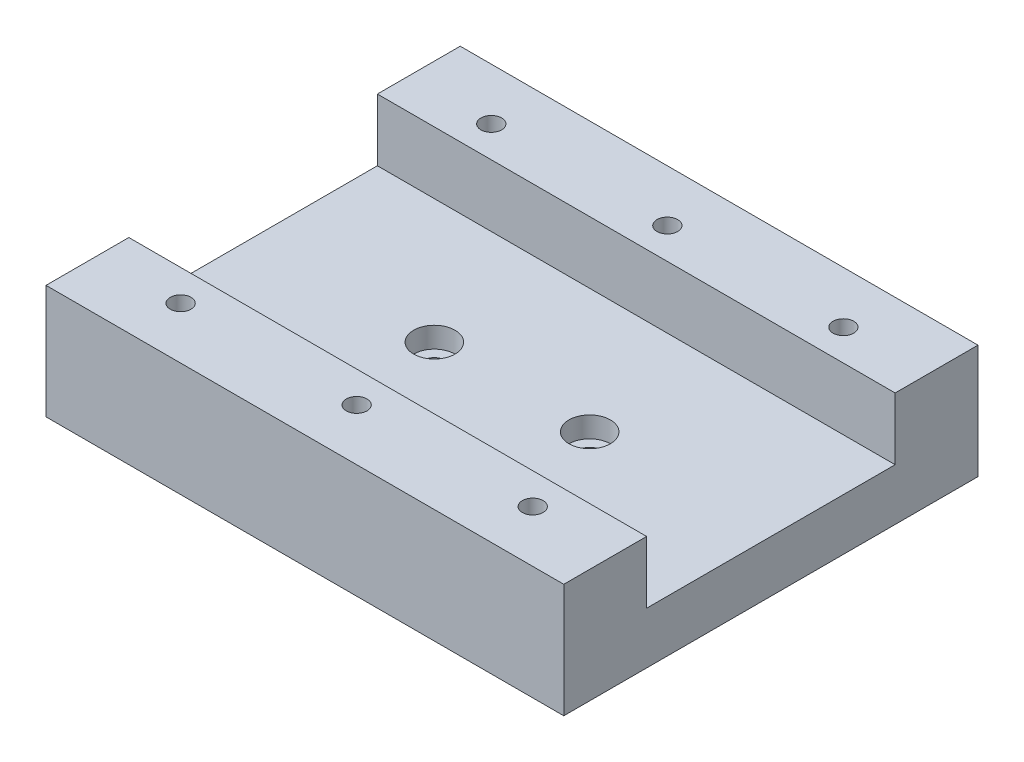
ISO-10303-21;
HEADER;
FILE_DESCRIPTION(('STEP AP214'),'2;1');
FILE_NAME('part.step','',(''),(''),'','','');
FILE_SCHEMA(('AUTOMOTIVE_DESIGN { 1 0 10303 214 1 1 1 1 }'));
ENDSEC;
DATA;
#1=APPLICATION_CONTEXT('core data for automotive mechanical design processes');
#2=APPLICATION_PROTOCOL_DEFINITION('international standard','automotive_design',2000,#1);
#3=PRODUCT_CONTEXT('',#1,'mechanical');
#4=PRODUCT('Part','Part','',(#3));
#5=PRODUCT_RELATED_PRODUCT_CATEGORY('part','',(#4));
#6=PRODUCT_DEFINITION_FORMATION('','',#4);
#7=PRODUCT_DEFINITION_CONTEXT('part definition',#1,'design');
#8=PRODUCT_DEFINITION('design','',#6,#7);
#9=PRODUCT_DEFINITION_SHAPE('','',#8);
#10=(LENGTH_UNIT() NAMED_UNIT(*) SI_UNIT(.MILLI.,.METRE.));
#11=(NAMED_UNIT(*) PLANE_ANGLE_UNIT() SI_UNIT($,.RADIAN.));
#12=(NAMED_UNIT(*) SI_UNIT($,.STERADIAN.) SOLID_ANGLE_UNIT());
#13=UNCERTAINTY_MEASURE_WITH_UNIT(LENGTH_MEASURE(1.E-05),#10,'distance_accuracy_value','');
#14=(GEOMETRIC_REPRESENTATION_CONTEXT(3) GLOBAL_UNCERTAINTY_ASSIGNED_CONTEXT((#13)) GLOBAL_UNIT_ASSIGNED_CONTEXT((#10,
#11,#12)) REPRESENTATION_CONTEXT('',''));
#15=CARTESIAN_POINT('',(0.,0.,0.));
#16=DIRECTION('',(0.,0.,1.));
#17=DIRECTION('',(1.,0.,0.));
#18=AXIS2_PLACEMENT_3D('',#15,#16,#17);
#19=CARTESIAN_POINT('',(0.,5.,0.));
#20=DIRECTION('',(0.,1.,0.));
#21=DIRECTION('',(0.,0.,1.));
#22=AXIS2_PLACEMENT_3D('',#19,#20,#21);
#23=PLANE('',#22);
#24=CARTESIAN_POINT('',(-7.5,5.,0.));
#25=DIRECTION('',(0.,1.,0.));
#26=DIRECTION('',(0.,0.,1.));
#27=AXIS2_PLACEMENT_3D('',#24,#25,#26);
#28=CIRCLE('',#27,2.);
#29=CARTESIAN_POINT('',(-7.5,5.,2.));
#30=VERTEX_POINT('',#29);
#31=EDGE_CURVE('E160',#30,#30,#28,.T.);
#32=ORIENTED_EDGE('',*,*,#31,.F.);
#33=EDGE_LOOP('',(#32));
#34=FACE_BOUND('',#33,.T.);
#35=CARTESIAN_POINT('',(7.5,5.,0.));
#36=DIRECTION('',(0.,1.,0.));
#37=DIRECTION('',(0.,0.,1.));
#38=AXIS2_PLACEMENT_3D('',#35,#36,#37);
#39=CIRCLE('',#38,2.);
#40=CARTESIAN_POINT('',(7.5,5.,2.));
#41=VERTEX_POINT('',#40);
#42=EDGE_CURVE('E165',#41,#41,#39,.T.);
#43=ORIENTED_EDGE('',*,*,#42,.F.);
#44=EDGE_LOOP('',(#43));
#45=FACE_BOUND('',#44,.T.);
#46=DIRECTION('',(0.,0.,1.));
#47=VECTOR('',#46,1.);
#48=CARTESIAN_POINT('',(-25.,5.,-20.));
#49=LINE('',#48,#47);
#50=CARTESIAN_POINT('',(-25.,5.,-12.));
#51=VERTEX_POINT('',#50);
#52=CARTESIAN_POINT('',(-25.,5.,12.));
#53=VERTEX_POINT('',#52);
#54=EDGE_CURVE('E125',#51,#53,#49,.T.);
#55=ORIENTED_EDGE('',*,*,#54,.T.);
#56=DIRECTION('',(-1.,0.,0.));
#57=VECTOR('',#56,1.);
#58=CARTESIAN_POINT('',(-25.,5.,12.));
#59=LINE('',#58,#57);
#60=CARTESIAN_POINT('',(25.,5.,12.));
#61=VERTEX_POINT('',#60);
#62=EDGE_CURVE('E114',#61,#53,#59,.T.);
#63=ORIENTED_EDGE('',*,*,#62,.F.);
#64=DIRECTION('',(0.,0.,-1.));
#65=VECTOR('',#64,1.);
#66=CARTESIAN_POINT('',(25.,5.,-20.));
#67=LINE('',#66,#65);
#68=CARTESIAN_POINT('',(25.,5.,-12.));
#69=VERTEX_POINT('',#68);
#70=EDGE_CURVE('E131',#61,#69,#67,.T.);
#71=ORIENTED_EDGE('',*,*,#70,.T.);
#72=DIRECTION('',(1.,0.,0.));
#73=VECTOR('',#72,1.);
#74=CARTESIAN_POINT('',(-25.,5.,-12.));
#75=LINE('',#74,#73);
#76=EDGE_CURVE('E72',#51,#69,#75,.T.);
#77=ORIENTED_EDGE('',*,*,#76,.F.);
#78=EDGE_LOOP('',(#55,#63,#71,#77));
#79=FACE_BOUND('',#78,.T.);
#80=ADVANCED_FACE('F47',(#34,#45,#79),#23,.T.);
#81=CARTESIAN_POINT('',(7.5,0.,0.));
#82=DIRECTION('',(0.,1.,0.));
#83=DIRECTION('',(0.,0.,1.));
#84=AXIS2_PLACEMENT_3D('',#81,#82,#83);
#85=CYLINDRICAL_SURFACE('',#84,1.);
#86=CARTESIAN_POINT('',(7.5,0.,0.));
#87=DIRECTION('',(0.,1.,0.));
#88=DIRECTION('',(0.,0.,1.));
#89=AXIS2_PLACEMENT_3D('',#86,#87,#88);
#90=CIRCLE('',#89,1.);
#91=CARTESIAN_POINT('',(7.5,0.,0.999999999999997));
#92=VERTEX_POINT('',#91);
#93=EDGE_CURVE('E158',#92,#92,#90,.T.);
#94=ORIENTED_EDGE('',*,*,#93,.F.);
#95=EDGE_LOOP('',(#94));
#96=FACE_BOUND('',#95,.T.);
#97=CARTESIAN_POINT('',(7.5,3.,0.));
#98=DIRECTION('',(0.,1.,0.));
#99=DIRECTION('',(0.,0.,1.));
#100=AXIS2_PLACEMENT_3D('',#97,#98,#99);
#101=CIRCLE('',#100,1.);
#102=CARTESIAN_POINT('',(7.5,3.,0.999999999999997));
#103=VERTEX_POINT('',#102);
#104=EDGE_CURVE('E51',#103,#103,#101,.F.);
#105=ORIENTED_EDGE('',*,*,#104,.F.);
#106=EDGE_LOOP('',(#105));
#107=FACE_BOUND('',#106,.T.);
#108=ADVANCED_FACE('F183',(#96,#107),#85,.F.);
#109=CARTESIAN_POINT('',(-7.5,0.,0.));
#110=DIRECTION('',(0.,1.,0.));
#111=DIRECTION('',(0.,0.,1.));
#112=AXIS2_PLACEMENT_3D('',#109,#110,#111);
#113=CYLINDRICAL_SURFACE('',#112,1.);
#114=CARTESIAN_POINT('',(-7.5,0.,0.));
#115=DIRECTION('',(0.,1.,0.));
#116=DIRECTION('',(0.,0.,1.));
#117=AXIS2_PLACEMENT_3D('',#114,#115,#116);
#118=CIRCLE('',#117,1.);
#119=CARTESIAN_POINT('',(-7.5,0.,1.));
#120=VERTEX_POINT('',#119);
#121=EDGE_CURVE('E144',#120,#120,#118,.T.);
#122=ORIENTED_EDGE('',*,*,#121,.F.);
#123=EDGE_LOOP('',(#122));
#124=FACE_BOUND('',#123,.T.);
#125=CARTESIAN_POINT('',(-7.5,3.,0.));
#126=DIRECTION('',(0.,1.,0.));
#127=DIRECTION('',(0.,0.,1.));
#128=AXIS2_PLACEMENT_3D('',#125,#126,#127);
#129=CIRCLE('',#128,1.);
#130=CARTESIAN_POINT('',(-7.5,3.,1.));
#131=VERTEX_POINT('',#130);
#132=EDGE_CURVE('E152',#131,#131,#129,.F.);
#133=ORIENTED_EDGE('',*,*,#132,.F.);
#134=EDGE_LOOP('',(#133));
#135=FACE_BOUND('',#134,.T.);
#136=ADVANCED_FACE('F186',(#124,#135),#113,.F.);
#137=CARTESIAN_POINT('',(25.,5.,-20.));
#138=DIRECTION('',(-1.,0.,0.));
#139=DIRECTION('',(0.,0.,1.));
#140=AXIS2_PLACEMENT_3D('',#137,#138,#139);
#141=PLANE('',#140);
#142=DIRECTION('',(0.,0.,-1.));
#143=VECTOR('',#142,1.);
#144=CARTESIAN_POINT('',(25.,0.,-20.));
#145=LINE('',#144,#143);
#146=CARTESIAN_POINT('',(25.,0.,20.));
#147=VERTEX_POINT('',#146);
#148=CARTESIAN_POINT('',(25.,0.,-20.));
#149=VERTEX_POINT('',#148);
#150=EDGE_CURVE('E140',#147,#149,#145,.T.);
#151=ORIENTED_EDGE('',*,*,#150,.T.);
#152=DIRECTION('',(0.,-1.,0.));
#153=VECTOR('',#152,1.);
#154=CARTESIAN_POINT('',(25.,5.,-20.));
#155=LINE('',#154,#153);
#156=CARTESIAN_POINT('',(25.,11.,-20.));
#157=VERTEX_POINT('',#156);
#158=EDGE_CURVE('E12',#157,#149,#155,.T.);
#159=ORIENTED_EDGE('',*,*,#158,.F.);
#160=DIRECTION('',(0.,0.,-1.));
#161=VECTOR('',#160,1.);
#162=CARTESIAN_POINT('',(25.,11.,-20.));
#163=LINE('',#162,#161);
#164=CARTESIAN_POINT('',(25.,11.,-12.));
#165=VERTEX_POINT('',#164);
#166=EDGE_CURVE('E252',#165,#157,#163,.T.);
#167=ORIENTED_EDGE('',*,*,#166,.F.);
#168=DIRECTION('',(0.,-1.,0.));
#169=VECTOR('',#168,1.);
#170=CARTESIAN_POINT('',(25.,11.,-12.));
#171=LINE('',#170,#169);
#172=EDGE_CURVE('E257',#165,#69,#171,.T.);
#173=ORIENTED_EDGE('',*,*,#172,.T.);
#174=ORIENTED_EDGE('',*,*,#70,.F.);
#175=DIRECTION('',(0.,-1.,0.));
#176=VECTOR('',#175,1.);
#177=CARTESIAN_POINT('',(25.,11.,12.));
#178=LINE('',#177,#176);
#179=CARTESIAN_POINT('',(25.,11.,12.));
#180=VERTEX_POINT('',#179);
#181=EDGE_CURVE('E64',#180,#61,#178,.T.);
#182=ORIENTED_EDGE('',*,*,#181,.F.);
#183=DIRECTION('',(0.,0.,-1.));
#184=VECTOR('',#183,1.);
#185=CARTESIAN_POINT('',(25.,11.,20.));
#186=LINE('',#185,#184);
#187=CARTESIAN_POINT('',(25.,11.,20.));
#188=VERTEX_POINT('',#187);
#189=EDGE_CURVE('E241',#188,#180,#186,.T.);
#190=ORIENTED_EDGE('',*,*,#189,.F.);
#191=DIRECTION('',(0.,-1.,0.));
#192=VECTOR('',#191,1.);
#193=CARTESIAN_POINT('',(25.,5.,20.));
#194=LINE('',#193,#192);
#195=EDGE_CURVE('E130',#188,#147,#194,.T.);
#196=ORIENTED_EDGE('',*,*,#195,.T.);
#197=EDGE_LOOP('',(#151,#159,#167,#173,#174,#182,#190,#196));
#198=FACE_BOUND('',#197,.T.);
#199=ADVANCED_FACE('F49',(#198),#141,.F.);
#200=CARTESIAN_POINT('',(-25.,5.,-20.));
#201=DIRECTION('',(0.,0.,1.));
#202=DIRECTION('',(1.,0.,0.));
#203=AXIS2_PLACEMENT_3D('',#200,#201,#202);
#204=PLANE('',#203);
#205=DIRECTION('',(-1.,0.,0.));
#206=VECTOR('',#205,1.);
#207=CARTESIAN_POINT('',(-25.,0.,-20.));
#208=LINE('',#207,#206);
#209=CARTESIAN_POINT('',(-25.,0.,-20.));
#210=VERTEX_POINT('',#209);
#211=EDGE_CURVE('E143',#149,#210,#208,.T.);
#212=ORIENTED_EDGE('',*,*,#211,.T.);
#213=DIRECTION('',(0.,-1.,0.));
#214=VECTOR('',#213,1.);
#215=CARTESIAN_POINT('',(-25.,5.,-20.));
#216=LINE('',#215,#214);
#217=CARTESIAN_POINT('',(-25.,11.,-20.));
#218=VERTEX_POINT('',#217);
#219=EDGE_CURVE('E56',#218,#210,#216,.T.);
#220=ORIENTED_EDGE('',*,*,#219,.F.);
#221=DIRECTION('',(-1.,0.,0.));
#222=VECTOR('',#221,1.);
#223=CARTESIAN_POINT('',(-25.,11.,-20.));
#224=LINE('',#223,#222);
#225=EDGE_CURVE('E255',#157,#218,#224,.T.);
#226=ORIENTED_EDGE('',*,*,#225,.F.);
#227=ORIENTED_EDGE('',*,*,#158,.T.);
#228=EDGE_LOOP('',(#212,#220,#226,#227));
#229=FACE_BOUND('',#228,.T.);
#230=ADVANCED_FACE('F223',(#229),#204,.F.);
#231=CARTESIAN_POINT('',(-25.,5.,-20.));
#232=DIRECTION('',(1.,0.,0.));
#233=DIRECTION('',(0.,0.,-1.));
#234=AXIS2_PLACEMENT_3D('',#231,#232,#233);
#235=PLANE('',#234);
#236=DIRECTION('',(0.,0.,1.));
#237=VECTOR('',#236,1.);
#238=CARTESIAN_POINT('',(-25.,0.,-20.));
#239=LINE('',#238,#237);
#240=CARTESIAN_POINT('',(-25.,0.,20.));
#241=VERTEX_POINT('',#240);
#242=EDGE_CURVE('E146',#210,#241,#239,.T.);
#243=ORIENTED_EDGE('',*,*,#242,.T.);
#244=DIRECTION('',(0.,-1.,0.));
#245=VECTOR('',#244,1.);
#246=CARTESIAN_POINT('',(-25.,5.,20.));
#247=LINE('',#246,#245);
#248=CARTESIAN_POINT('',(-25.,11.,20.));
#249=VERTEX_POINT('',#248);
#250=EDGE_CURVE('E134',#249,#241,#247,.T.);
#251=ORIENTED_EDGE('',*,*,#250,.F.);
#252=DIRECTION('',(0.,0.,1.));
#253=VECTOR('',#252,1.);
#254=CARTESIAN_POINT('',(-25.,11.,20.));
#255=LINE('',#254,#253);
#256=CARTESIAN_POINT('',(-25.,11.,12.));
#257=VERTEX_POINT('',#256);
#258=EDGE_CURVE('E120',#257,#249,#255,.T.);
#259=ORIENTED_EDGE('',*,*,#258,.F.);
#260=DIRECTION('',(0.,-1.,0.));
#261=VECTOR('',#260,1.);
#262=CARTESIAN_POINT('',(-25.,11.,12.));
#263=LINE('',#262,#261);
#264=EDGE_CURVE('E117',#257,#53,#263,.T.);
#265=ORIENTED_EDGE('',*,*,#264,.T.);
#266=ORIENTED_EDGE('',*,*,#54,.F.);
#267=DIRECTION('',(0.,-1.,0.));
#268=VECTOR('',#267,1.);
#269=CARTESIAN_POINT('',(-25.,11.,-12.));
#270=LINE('',#269,#268);
#271=CARTESIAN_POINT('',(-25.,11.,-12.));
#272=VERTEX_POINT('',#271);
#273=EDGE_CURVE('E168',#272,#51,#270,.T.);
#274=ORIENTED_EDGE('',*,*,#273,.F.);
#275=DIRECTION('',(0.,0.,1.));
#276=VECTOR('',#275,1.);
#277=CARTESIAN_POINT('',(-25.,11.,-20.));
#278=LINE('',#277,#276);
#279=EDGE_CURVE('E236',#218,#272,#278,.T.);
#280=ORIENTED_EDGE('',*,*,#279,.F.);
#281=ORIENTED_EDGE('',*,*,#219,.T.);
#282=EDGE_LOOP('',(#243,#251,#259,#265,#266,#274,#280,#281));
#283=FACE_BOUND('',#282,.T.);
#284=ADVANCED_FACE('F123',(#283),#235,.F.);
#285=CARTESIAN_POINT('',(-25.,5.,20.));
#286=DIRECTION('',(0.,0.,-1.));
#287=DIRECTION('',(-1.,0.,0.));
#288=AXIS2_PLACEMENT_3D('',#285,#286,#287);
#289=PLANE('',#288);
#290=DIRECTION('',(1.,0.,0.));
#291=VECTOR('',#290,1.);
#292=CARTESIAN_POINT('',(-25.,0.,20.));
#293=LINE('',#292,#291);
#294=EDGE_CURVE('E136',#241,#147,#293,.T.);
#295=ORIENTED_EDGE('',*,*,#294,.T.);
#296=ORIENTED_EDGE('',*,*,#195,.F.);
#297=DIRECTION('',(1.,0.,0.));
#298=VECTOR('',#297,1.);
#299=CARTESIAN_POINT('',(-25.,11.,20.));
#300=LINE('',#299,#298);
#301=EDGE_CURVE('E243',#249,#188,#300,.T.);
#302=ORIENTED_EDGE('',*,*,#301,.F.);
#303=ORIENTED_EDGE('',*,*,#250,.T.);
#304=EDGE_LOOP('',(#295,#296,#302,#303));
#305=FACE_BOUND('',#304,.T.);
#306=ADVANCED_FACE('F217',(#305),#289,.F.);
#307=CARTESIAN_POINT('',(0.,0.,0.));
#308=DIRECTION('',(0.,1.,0.));
#309=DIRECTION('',(0.,0.,1.));
#310=AXIS2_PLACEMENT_3D('',#307,#308,#309);
#311=PLANE('',#310);
#312=CARTESIAN_POINT('',(0.,0.,-15.));
#313=DIRECTION('',(0.,1.,0.));
#314=DIRECTION('',(0.,0.,1.));
#315=AXIS2_PLACEMENT_3D('',#312,#313,#314);
#316=CIRCLE('',#315,1.);
#317=CARTESIAN_POINT('',(0.,0.,-14.));
#318=VERTEX_POINT('',#317);
#319=EDGE_CURVE('E449',#318,#318,#316,.T.);
#320=ORIENTED_EDGE('',*,*,#319,.T.);
#321=EDGE_LOOP('',(#320));
#322=FACE_BOUND('',#321,.T.);
#323=CARTESIAN_POINT('',(17.,0.,-15.));
#324=DIRECTION('',(0.,1.,0.));
#325=DIRECTION('',(0.,0.,1.));
#326=AXIS2_PLACEMENT_3D('',#323,#324,#325);
#327=CIRCLE('',#326,1.);
#328=CARTESIAN_POINT('',(17.,0.,-14.));
#329=VERTEX_POINT('',#328);
#330=EDGE_CURVE('E461',#329,#329,#327,.T.);
#331=ORIENTED_EDGE('',*,*,#330,.T.);
#332=EDGE_LOOP('',(#331));
#333=FACE_BOUND('',#332,.T.);
#334=CARTESIAN_POINT('',(-17.,0.,15.));
#335=DIRECTION('',(0.,1.,0.));
#336=DIRECTION('',(0.,0.,1.));
#337=AXIS2_PLACEMENT_3D('',#334,#335,#336);
#338=CIRCLE('',#337,1.);
#339=CARTESIAN_POINT('',(-17.,0.,16.));
#340=VERTEX_POINT('',#339);
#341=EDGE_CURVE('E467',#340,#340,#338,.T.);
#342=ORIENTED_EDGE('',*,*,#341,.T.);
#343=EDGE_LOOP('',(#342));
#344=FACE_BOUND('',#343,.T.);
#345=CARTESIAN_POINT('',(0.,0.,15.));
#346=DIRECTION('',(0.,1.,0.));
#347=DIRECTION('',(0.,0.,1.));
#348=AXIS2_PLACEMENT_3D('',#345,#346,#347);
#349=CIRCLE('',#348,1.);
#350=CARTESIAN_POINT('',(0.,0.,16.));
#351=VERTEX_POINT('',#350);
#352=EDGE_CURVE('E473',#351,#351,#349,.T.);
#353=ORIENTED_EDGE('',*,*,#352,.T.);
#354=EDGE_LOOP('',(#353));
#355=FACE_BOUND('',#354,.T.);
#356=CARTESIAN_POINT('',(17.,0.,15.));
#357=DIRECTION('',(0.,1.,0.));
#358=DIRECTION('',(0.,0.,1.));
#359=AXIS2_PLACEMENT_3D('',#356,#357,#358);
#360=CIRCLE('',#359,1.);
#361=CARTESIAN_POINT('',(17.,0.,16.));
#362=VERTEX_POINT('',#361);
#363=EDGE_CURVE('E543',#362,#362,#360,.T.);
#364=ORIENTED_EDGE('',*,*,#363,.T.);
#365=EDGE_LOOP('',(#364));
#366=FACE_BOUND('',#365,.T.);
#367=CARTESIAN_POINT('',(-17.,0.,-15.));
#368=DIRECTION('',(0.,1.,0.));
#369=DIRECTION('',(0.,0.,1.));
#370=AXIS2_PLACEMENT_3D('',#367,#368,#369);
#371=CIRCLE('',#370,1.);
#372=CARTESIAN_POINT('',(-17.,0.,-14.));
#373=VERTEX_POINT('',#372);
#374=EDGE_CURVE('E455',#373,#373,#371,.T.);
#375=ORIENTED_EDGE('',*,*,#374,.T.);
#376=EDGE_LOOP('',(#375));
#377=FACE_BOUND('',#376,.T.);
#378=ORIENTED_EDGE('',*,*,#121,.T.);
#379=EDGE_LOOP('',(#378));
#380=FACE_BOUND('',#379,.T.);
#381=ORIENTED_EDGE('',*,*,#93,.T.);
#382=EDGE_LOOP('',(#381));
#383=FACE_BOUND('',#382,.T.);
#384=ORIENTED_EDGE('',*,*,#150,.F.);
#385=ORIENTED_EDGE('',*,*,#294,.F.);
#386=ORIENTED_EDGE('',*,*,#242,.F.);
#387=ORIENTED_EDGE('',*,*,#211,.F.);
#388=EDGE_LOOP('',(#384,#385,#386,#387));
#389=FACE_BOUND('',#388,.T.);
#390=ADVANCED_FACE('F180',(#322,#333,#344,#355,#366,#377,#380,#383,#389),#311,.F.);
#391=CARTESIAN_POINT('',(-7.5,3.,0.));
#392=DIRECTION('',(0.,1.,0.));
#393=DIRECTION('',(0.,0.,1.));
#394=AXIS2_PLACEMENT_3D('',#391,#392,#393);
#395=PLANE('',#394);
#396=CARTESIAN_POINT('',(-7.5,3.,0.));
#397=DIRECTION('',(0.,1.,0.));
#398=DIRECTION('',(0.,0.,1.));
#399=AXIS2_PLACEMENT_3D('',#396,#397,#398);
#400=CIRCLE('',#399,2.);
#401=CARTESIAN_POINT('',(-7.5,3.,2.));
#402=VERTEX_POINT('',#401);
#403=EDGE_CURVE('E154',#402,#402,#400,.T.);
#404=ORIENTED_EDGE('',*,*,#403,.T.);
#405=EDGE_LOOP('',(#404));
#406=FACE_BOUND('',#405,.T.);
#407=ORIENTED_EDGE('',*,*,#132,.T.);
#408=EDGE_LOOP('',(#407));
#409=FACE_BOUND('',#408,.T.);
#410=ADVANCED_FACE('F203',(#406,#409),#395,.T.);
#411=CARTESIAN_POINT('',(-7.5,3.,0.));
#412=DIRECTION('',(0.,1.,0.));
#413=DIRECTION('',(0.,0.,1.));
#414=AXIS2_PLACEMENT_3D('',#411,#412,#413);
#415=CYLINDRICAL_SURFACE('',#414,2.);
#416=ORIENTED_EDGE('',*,*,#403,.F.);
#417=EDGE_LOOP('',(#416));
#418=FACE_BOUND('',#417,.T.);
#419=ORIENTED_EDGE('',*,*,#31,.T.);
#420=EDGE_LOOP('',(#419));
#421=FACE_BOUND('',#420,.T.);
#422=ADVANCED_FACE('F193',(#418,#421),#415,.F.);
#423=CARTESIAN_POINT('',(7.5,3.,0.));
#424=DIRECTION('',(0.,1.,0.));
#425=DIRECTION('',(0.,0.,1.));
#426=AXIS2_PLACEMENT_3D('',#423,#424,#425);
#427=PLANE('',#426);
#428=CARTESIAN_POINT('',(7.5,3.,0.));
#429=DIRECTION('',(0.,1.,0.));
#430=DIRECTION('',(0.,0.,1.));
#431=AXIS2_PLACEMENT_3D('',#428,#429,#430);
#432=CIRCLE('',#431,2.);
#433=CARTESIAN_POINT('',(7.5,3.,2.));
#434=VERTEX_POINT('',#433);
#435=EDGE_CURVE('E173',#434,#434,#432,.T.);
#436=ORIENTED_EDGE('',*,*,#435,.T.);
#437=EDGE_LOOP('',(#436));
#438=FACE_BOUND('',#437,.T.);
#439=ORIENTED_EDGE('',*,*,#104,.T.);
#440=EDGE_LOOP('',(#439));
#441=FACE_BOUND('',#440,.T.);
#442=ADVANCED_FACE('F190',(#438,#441),#427,.T.);
#443=CARTESIAN_POINT('',(7.5,3.,0.));
#444=DIRECTION('',(0.,1.,0.));
#445=DIRECTION('',(0.,0.,1.));
#446=AXIS2_PLACEMENT_3D('',#443,#444,#445);
#447=CYLINDRICAL_SURFACE('',#446,2.);
#448=ORIENTED_EDGE('',*,*,#435,.F.);
#449=EDGE_LOOP('',(#448));
#450=FACE_BOUND('',#449,.T.);
#451=ORIENTED_EDGE('',*,*,#42,.T.);
#452=EDGE_LOOP('',(#451));
#453=FACE_BOUND('',#452,.T.);
#454=ADVANCED_FACE('F192',(#450,#453),#447,.F.);
#455=CARTESIAN_POINT('',(-25.,11.,-12.));
#456=DIRECTION('',(0.,0.,-1.));
#457=DIRECTION('',(-1.,0.,0.));
#458=AXIS2_PLACEMENT_3D('',#455,#456,#457);
#459=PLANE('',#458);
#460=ORIENTED_EDGE('',*,*,#76,.T.);
#461=ORIENTED_EDGE('',*,*,#172,.F.);
#462=DIRECTION('',(1.,0.,0.));
#463=VECTOR('',#462,1.);
#464=CARTESIAN_POINT('',(-25.,11.,-12.));
#465=LINE('',#464,#463);
#466=EDGE_CURVE('E250',#272,#165,#465,.T.);
#467=ORIENTED_EDGE('',*,*,#466,.F.);
#468=ORIENTED_EDGE('',*,*,#273,.T.);
#469=EDGE_LOOP('',(#460,#461,#467,#468));
#470=FACE_BOUND('',#469,.T.);
#471=ADVANCED_FACE('F200',(#470),#459,.F.);
#472=CARTESIAN_POINT('',(0.,11.,0.));
#473=DIRECTION('',(0.,1.,0.));
#474=DIRECTION('',(0.,0.,1.));
#475=AXIS2_PLACEMENT_3D('',#472,#473,#474);
#476=PLANE('',#475);
#477=CARTESIAN_POINT('',(0.,11.,-15.));
#478=DIRECTION('',(0.,1.,0.));
#479=DIRECTION('',(0.,0.,1.));
#480=AXIS2_PLACEMENT_3D('',#477,#478,#479);
#481=CIRCLE('',#480,1.);
#482=CARTESIAN_POINT('',(0.,11.,-14.));
#483=VERTEX_POINT('',#482);
#484=EDGE_CURVE('E451',#483,#483,#481,.T.);
#485=ORIENTED_EDGE('',*,*,#484,.F.);
#486=EDGE_LOOP('',(#485));
#487=FACE_BOUND('',#486,.T.);
#488=CARTESIAN_POINT('',(17.,11.,-15.));
#489=DIRECTION('',(0.,1.,0.));
#490=DIRECTION('',(0.,0.,1.));
#491=AXIS2_PLACEMENT_3D('',#488,#489,#490);
#492=CIRCLE('',#491,1.);
#493=CARTESIAN_POINT('',(17.,11.,-14.));
#494=VERTEX_POINT('',#493);
#495=EDGE_CURVE('E457',#494,#494,#492,.T.);
#496=ORIENTED_EDGE('',*,*,#495,.F.);
#497=EDGE_LOOP('',(#496));
#498=FACE_BOUND('',#497,.T.);
#499=CARTESIAN_POINT('',(-17.,11.,-15.));
#500=DIRECTION('',(0.,1.,0.));
#501=DIRECTION('',(0.,0.,1.));
#502=AXIS2_PLACEMENT_3D('',#499,#500,#501);
#503=CIRCLE('',#502,1.);
#504=CARTESIAN_POINT('',(-17.,11.,-14.));
#505=VERTEX_POINT('',#504);
#506=EDGE_CURVE('E452',#505,#505,#503,.T.);
#507=ORIENTED_EDGE('',*,*,#506,.F.);
#508=EDGE_LOOP('',(#507));
#509=FACE_BOUND('',#508,.T.);
#510=ORIENTED_EDGE('',*,*,#279,.T.);
#511=ORIENTED_EDGE('',*,*,#466,.T.);
#512=ORIENTED_EDGE('',*,*,#166,.T.);
#513=ORIENTED_EDGE('',*,*,#225,.T.);
#514=EDGE_LOOP('',(#510,#511,#512,#513));
#515=FACE_BOUND('',#514,.T.);
#516=ADVANCED_FACE('F263',(#487,#498,#509,#515),#476,.T.);
#517=CARTESIAN_POINT('',(-25.,11.,12.));
#518=DIRECTION('',(0.,0.,1.));
#519=DIRECTION('',(1.,0.,0.));
#520=AXIS2_PLACEMENT_3D('',#517,#518,#519);
#521=PLANE('',#520);
#522=ORIENTED_EDGE('',*,*,#62,.T.);
#523=ORIENTED_EDGE('',*,*,#264,.F.);
#524=DIRECTION('',(-1.,0.,0.));
#525=VECTOR('',#524,1.);
#526=CARTESIAN_POINT('',(-25.,11.,12.));
#527=LINE('',#526,#525);
#528=EDGE_CURVE('E128',#180,#257,#527,.T.);
#529=ORIENTED_EDGE('',*,*,#528,.F.);
#530=ORIENTED_EDGE('',*,*,#181,.T.);
#531=EDGE_LOOP('',(#522,#523,#529,#530));
#532=FACE_BOUND('',#531,.T.);
#533=ADVANCED_FACE('F116',(#532),#521,.F.);
#534=CARTESIAN_POINT('',(0.,11.,0.));
#535=DIRECTION('',(0.,-1.,0.));
#536=DIRECTION('',(0.,0.,-1.));
#537=AXIS2_PLACEMENT_3D('',#534,#535,#536);
#538=PLANE('',#537);
#539=CARTESIAN_POINT('',(-17.,11.,15.));
#540=DIRECTION('',(0.,1.,0.));
#541=DIRECTION('',(0.,0.,1.));
#542=AXIS2_PLACEMENT_3D('',#539,#540,#541);
#543=CIRCLE('',#542,1.);
#544=CARTESIAN_POINT('',(-17.,11.,16.));
#545=VERTEX_POINT('',#544);
#546=EDGE_CURVE('E464',#545,#545,#543,.T.);
#547=ORIENTED_EDGE('',*,*,#546,.F.);
#548=EDGE_LOOP('',(#547));
#549=FACE_BOUND('',#548,.T.);
#550=CARTESIAN_POINT('',(0.,11.,15.));
#551=DIRECTION('',(0.,1.,0.));
#552=DIRECTION('',(0.,0.,1.));
#553=AXIS2_PLACEMENT_3D('',#550,#551,#552);
#554=CIRCLE('',#553,1.);
#555=CARTESIAN_POINT('',(0.,11.,16.));
#556=VERTEX_POINT('',#555);
#557=EDGE_CURVE('E470',#556,#556,#554,.T.);
#558=ORIENTED_EDGE('',*,*,#557,.F.);
#559=EDGE_LOOP('',(#558));
#560=FACE_BOUND('',#559,.T.);
#561=CARTESIAN_POINT('',(17.,11.,15.));
#562=DIRECTION('',(0.,1.,0.));
#563=DIRECTION('',(0.,0.,1.));
#564=AXIS2_PLACEMENT_3D('',#561,#562,#563);
#565=CIRCLE('',#564,1.);
#566=CARTESIAN_POINT('',(17.,11.,16.));
#567=VERTEX_POINT('',#566);
#568=EDGE_CURVE('E476',#567,#567,#565,.T.);
#569=ORIENTED_EDGE('',*,*,#568,.F.);
#570=EDGE_LOOP('',(#569));
#571=FACE_BOUND('',#570,.T.);
#572=ORIENTED_EDGE('',*,*,#258,.T.);
#573=ORIENTED_EDGE('',*,*,#301,.T.);
#574=ORIENTED_EDGE('',*,*,#189,.T.);
#575=ORIENTED_EDGE('',*,*,#528,.T.);
#576=EDGE_LOOP('',(#572,#573,#574,#575));
#577=FACE_BOUND('',#576,.T.);
#578=ADVANCED_FACE('F271',(#549,#560,#571,#577),#538,.F.);
#579=CARTESIAN_POINT('',(17.,0.,15.));
#580=DIRECTION('',(0.,1.,0.));
#581=DIRECTION('',(0.,0.,1.));
#582=AXIS2_PLACEMENT_3D('',#579,#580,#581);
#583=CYLINDRICAL_SURFACE('',#582,1.);
#584=ORIENTED_EDGE('',*,*,#363,.F.);
#585=EDGE_LOOP('',(#584));
#586=FACE_BOUND('',#585,.T.);
#587=ORIENTED_EDGE('',*,*,#568,.T.);
#588=EDGE_LOOP('',(#587));
#589=FACE_BOUND('',#588,.T.);
#590=ADVANCED_FACE('F366',(#586,#589),#583,.F.);
#591=CARTESIAN_POINT('',(0.,0.,15.));
#592=DIRECTION('',(0.,1.,0.));
#593=DIRECTION('',(0.,0.,1.));
#594=AXIS2_PLACEMENT_3D('',#591,#592,#593);
#595=CYLINDRICAL_SURFACE('',#594,1.);
#596=ORIENTED_EDGE('',*,*,#352,.F.);
#597=EDGE_LOOP('',(#596));
#598=FACE_BOUND('',#597,.T.);
#599=ORIENTED_EDGE('',*,*,#557,.T.);
#600=EDGE_LOOP('',(#599));
#601=FACE_BOUND('',#600,.T.);
#602=ADVANCED_FACE('F376',(#598,#601),#595,.F.);
#603=CARTESIAN_POINT('',(-17.,0.,15.));
#604=DIRECTION('',(0.,1.,0.));
#605=DIRECTION('',(0.,0.,1.));
#606=AXIS2_PLACEMENT_3D('',#603,#604,#605);
#607=CYLINDRICAL_SURFACE('',#606,1.);
#608=ORIENTED_EDGE('',*,*,#341,.F.);
#609=EDGE_LOOP('',(#608));
#610=FACE_BOUND('',#609,.T.);
#611=ORIENTED_EDGE('',*,*,#546,.T.);
#612=EDGE_LOOP('',(#611));
#613=FACE_BOUND('',#612,.T.);
#614=ADVANCED_FACE('F387',(#610,#613),#607,.F.);
#615=CARTESIAN_POINT('',(-17.,0.,-15.));
#616=DIRECTION('',(0.,1.,0.));
#617=DIRECTION('',(0.,0.,1.));
#618=AXIS2_PLACEMENT_3D('',#615,#616,#617);
#619=CYLINDRICAL_SURFACE('',#618,1.);
#620=ORIENTED_EDGE('',*,*,#374,.F.);
#621=EDGE_LOOP('',(#620));
#622=FACE_BOUND('',#621,.T.);
#623=ORIENTED_EDGE('',*,*,#506,.T.);
#624=EDGE_LOOP('',(#623));
#625=FACE_BOUND('',#624,.T.);
#626=ADVANCED_FACE('F398',(#622,#625),#619,.F.);
#627=CARTESIAN_POINT('',(17.,0.,-15.));
#628=DIRECTION('',(0.,1.,0.));
#629=DIRECTION('',(0.,0.,1.));
#630=AXIS2_PLACEMENT_3D('',#627,#628,#629);
#631=CYLINDRICAL_SURFACE('',#630,1.);
#632=ORIENTED_EDGE('',*,*,#330,.F.);
#633=EDGE_LOOP('',(#632));
#634=FACE_BOUND('',#633,.T.);
#635=ORIENTED_EDGE('',*,*,#495,.T.);
#636=EDGE_LOOP('',(#635));
#637=FACE_BOUND('',#636,.T.);
#638=ADVANCED_FACE('F409',(#634,#637),#631,.F.);
#639=CARTESIAN_POINT('',(0.,0.,-15.));
#640=DIRECTION('',(0.,1.,0.));
#641=DIRECTION('',(0.,0.,1.));
#642=AXIS2_PLACEMENT_3D('',#639,#640,#641);
#643=CYLINDRICAL_SURFACE('',#642,1.);
#644=ORIENTED_EDGE('',*,*,#319,.F.);
#645=EDGE_LOOP('',(#644));
#646=FACE_BOUND('',#645,.T.);
#647=ORIENTED_EDGE('',*,*,#484,.T.);
#648=EDGE_LOOP('',(#647));
#649=FACE_BOUND('',#648,.T.);
#650=ADVANCED_FACE('F420',(#646,#649),#643,.F.);
#651=CLOSED_SHELL('',(#80,#108,#136,#199,#230,#284,#306,#390,#410,#422,#442,#454,#471,#516,#533,
#578,#590,#602,#614,#626,#638,#650));
#652=MANIFOLD_SOLID_BREP('B2',#651);
#653=ADVANCED_BREP_SHAPE_REPRESENTATION('',(#18,#652),#14);
#654=SHAPE_DEFINITION_REPRESENTATION(#9,#653);
ENDSEC;
END-ISO-10303-21;
